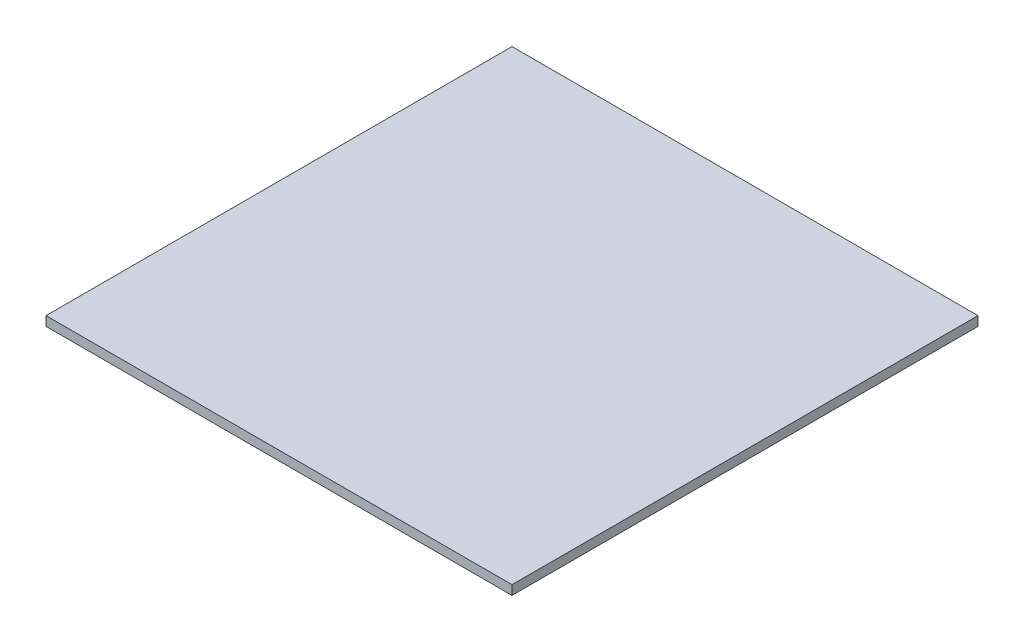
ISO-10303-21;
HEADER;
FILE_DESCRIPTION(('STEP AP214'),'2;1');
FILE_NAME('part.step','',(''),(''),'','','');
FILE_SCHEMA(('AUTOMOTIVE_DESIGN { 1 0 10303 214 1 1 1 1 }'));
ENDSEC;
DATA;
#1=APPLICATION_CONTEXT('core data for automotive mechanical design processes');
#2=APPLICATION_PROTOCOL_DEFINITION('international standard','automotive_design',2000,#1);
#3=PRODUCT_CONTEXT('',#1,'mechanical');
#4=PRODUCT('Part','Part','',(#3));
#5=PRODUCT_RELATED_PRODUCT_CATEGORY('part','',(#4));
#6=PRODUCT_DEFINITION_FORMATION('','',#4);
#7=PRODUCT_DEFINITION_CONTEXT('part definition',#1,'design');
#8=PRODUCT_DEFINITION('design','',#6,#7);
#9=PRODUCT_DEFINITION_SHAPE('','',#8);
#10=(LENGTH_UNIT() NAMED_UNIT(*) SI_UNIT(.MILLI.,.METRE.));
#11=(NAMED_UNIT(*) PLANE_ANGLE_UNIT() SI_UNIT($,.RADIAN.));
#12=(NAMED_UNIT(*) SI_UNIT($,.STERADIAN.) SOLID_ANGLE_UNIT());
#13=UNCERTAINTY_MEASURE_WITH_UNIT(LENGTH_MEASURE(1.E-05),#10,'distance_accuracy_value','');
#14=(GEOMETRIC_REPRESENTATION_CONTEXT(3) GLOBAL_UNCERTAINTY_ASSIGNED_CONTEXT((#13)) GLOBAL_UNIT_ASSIGNED_CONTEXT((#10,
#11,#12)) REPRESENTATION_CONTEXT('',''));
#15=CARTESIAN_POINT('',(0.,0.,0.));
#16=DIRECTION('',(0.,0.,1.));
#17=DIRECTION('',(1.,0.,0.));
#18=AXIS2_PLACEMENT_3D('',#15,#16,#17);
#19=CARTESIAN_POINT('',(0.,10.,0.));
#20=DIRECTION('',(1.,0.,0.));
#21=DIRECTION('',(0.,0.,-1.));
#22=AXIS2_PLACEMENT_3D('',#19,#20,#21);
#23=PLANE('',#22);
#24=DIRECTION('',(0.,0.,1.));
#25=VECTOR('',#24,1.);
#26=CARTESIAN_POINT('',(0.,0.,0.));
#27=LINE('',#26,#25);
#28=CARTESIAN_POINT('',(0.,0.,-500.));
#29=VERTEX_POINT('',#28);
#30=CARTESIAN_POINT('',(0.,0.,0.));
#31=VERTEX_POINT('',#30);
#32=EDGE_CURVE('E107',#29,#31,#27,.T.);
#33=ORIENTED_EDGE('',*,*,#32,.T.);
#34=DIRECTION('',(0.,-1.,0.));
#35=VECTOR('',#34,1.);
#36=CARTESIAN_POINT('',(0.,10.,0.));
#37=LINE('',#36,#35);
#38=CARTESIAN_POINT('',(0.,10.,0.));
#39=VERTEX_POINT('',#38);
#40=EDGE_CURVE('E11',#39,#31,#37,.T.);
#41=ORIENTED_EDGE('',*,*,#40,.F.);
#42=DIRECTION('',(0.,0.,1.));
#43=VECTOR('',#42,1.);
#44=CARTESIAN_POINT('',(0.,10.,0.));
#45=LINE('',#44,#43);
#46=CARTESIAN_POINT('',(0.,10.,-500.));
#47=VERTEX_POINT('',#46);
#48=EDGE_CURVE('E91',#47,#39,#45,.T.);
#49=ORIENTED_EDGE('',*,*,#48,.F.);
#50=DIRECTION('',(0.,-1.,0.));
#51=VECTOR('',#50,1.);
#52=CARTESIAN_POINT('',(0.,10.,-500.));
#53=LINE('',#52,#51);
#54=EDGE_CURVE('E103',#47,#29,#53,.T.);
#55=ORIENTED_EDGE('',*,*,#54,.T.);
#56=EDGE_LOOP('',(#33,#41,#49,#55));
#57=FACE_BOUND('',#56,.T.);
#58=ADVANCED_FACE('F39',(#57),#23,.F.);
#59=CARTESIAN_POINT('',(0.,10.,0.));
#60=DIRECTION('',(0.,0.,-1.));
#61=DIRECTION('',(-1.,0.,0.));
#62=AXIS2_PLACEMENT_3D('',#59,#60,#61);
#63=PLANE('',#62);
#64=DIRECTION('',(1.,0.,0.));
#65=VECTOR('',#64,1.);
#66=CARTESIAN_POINT('',(0.,0.,0.));
#67=LINE('',#66,#65);
#68=CARTESIAN_POINT('',(500.,0.,0.));
#69=VERTEX_POINT('',#68);
#70=EDGE_CURVE('E96',#31,#69,#67,.T.);
#71=ORIENTED_EDGE('',*,*,#70,.T.);
#72=DIRECTION('',(0.,-1.,0.));
#73=VECTOR('',#72,1.);
#74=CARTESIAN_POINT('',(500.,10.,0.));
#75=LINE('',#74,#73);
#76=CARTESIAN_POINT('',(500.,10.,0.));
#77=VERTEX_POINT('',#76);
#78=EDGE_CURVE('E48',#77,#69,#75,.T.);
#79=ORIENTED_EDGE('',*,*,#78,.F.);
#80=DIRECTION('',(1.,0.,0.));
#81=VECTOR('',#80,1.);
#82=CARTESIAN_POINT('',(0.,10.,0.));
#83=LINE('',#82,#81);
#84=EDGE_CURVE('E86',#39,#77,#83,.T.);
#85=ORIENTED_EDGE('',*,*,#84,.F.);
#86=ORIENTED_EDGE('',*,*,#40,.T.);
#87=EDGE_LOOP('',(#71,#79,#85,#86));
#88=FACE_BOUND('',#87,.T.);
#89=ADVANCED_FACE('F95',(#88),#63,.F.);
#90=CARTESIAN_POINT('',(500.,10.,0.));
#91=DIRECTION('',(-1.,0.,0.));
#92=DIRECTION('',(0.,0.,1.));
#93=AXIS2_PLACEMENT_3D('',#90,#91,#92);
#94=PLANE('',#93);
#95=DIRECTION('',(0.,0.,-1.));
#96=VECTOR('',#95,1.);
#97=CARTESIAN_POINT('',(500.,0.,0.));
#98=LINE('',#97,#96);
#99=CARTESIAN_POINT('',(500.,0.,-500.));
#100=VERTEX_POINT('',#99);
#101=EDGE_CURVE('E73',#69,#100,#98,.T.);
#102=ORIENTED_EDGE('',*,*,#101,.T.);
#103=DIRECTION('',(0.,-1.,0.));
#104=VECTOR('',#103,1.);
#105=CARTESIAN_POINT('',(500.,10.,-500.));
#106=LINE('',#105,#104);
#107=CARTESIAN_POINT('',(500.,10.,-500.));
#108=VERTEX_POINT('',#107);
#109=EDGE_CURVE('E98',#108,#100,#106,.T.);
#110=ORIENTED_EDGE('',*,*,#109,.F.);
#111=DIRECTION('',(0.,0.,-1.));
#112=VECTOR('',#111,1.);
#113=CARTESIAN_POINT('',(500.,10.,0.));
#114=LINE('',#113,#112);
#115=EDGE_CURVE('E89',#77,#108,#114,.T.);
#116=ORIENTED_EDGE('',*,*,#115,.F.);
#117=ORIENTED_EDGE('',*,*,#78,.T.);
#118=EDGE_LOOP('',(#102,#110,#116,#117));
#119=FACE_BOUND('',#118,.T.);
#120=ADVANCED_FACE('F99',(#119),#94,.F.);
#121=CARTESIAN_POINT('',(0.,10.,-500.));
#122=DIRECTION('',(0.,0.,1.));
#123=DIRECTION('',(1.,0.,0.));
#124=AXIS2_PLACEMENT_3D('',#121,#122,#123);
#125=PLANE('',#124);
#126=DIRECTION('',(-1.,0.,0.));
#127=VECTOR('',#126,1.);
#128=CARTESIAN_POINT('',(0.,0.,-500.));
#129=LINE('',#128,#127);
#130=EDGE_CURVE('E79',#100,#29,#129,.T.);
#131=ORIENTED_EDGE('',*,*,#130,.T.);
#132=ORIENTED_EDGE('',*,*,#54,.F.);
#133=DIRECTION('',(-1.,0.,0.));
#134=VECTOR('',#133,1.);
#135=CARTESIAN_POINT('',(0.,10.,-500.));
#136=LINE('',#135,#134);
#137=EDGE_CURVE('E56',#108,#47,#136,.T.);
#138=ORIENTED_EDGE('',*,*,#137,.F.);
#139=ORIENTED_EDGE('',*,*,#109,.T.);
#140=EDGE_LOOP('',(#131,#132,#138,#139));
#141=FACE_BOUND('',#140,.T.);
#142=ADVANCED_FACE('F120',(#141),#125,.F.);
#143=CARTESIAN_POINT('',(0.,10.,0.));
#144=DIRECTION('',(0.,-1.,0.));
#145=DIRECTION('',(0.,0.,-1.));
#146=AXIS2_PLACEMENT_3D('',#143,#144,#145);
#147=PLANE('',#146);
#148=ORIENTED_EDGE('',*,*,#48,.T.);
#149=ORIENTED_EDGE('',*,*,#84,.T.);
#150=ORIENTED_EDGE('',*,*,#115,.T.);
#151=ORIENTED_EDGE('',*,*,#137,.T.);
#152=EDGE_LOOP('',(#148,#149,#150,#151));
#153=FACE_BOUND('',#152,.T.);
#154=ADVANCED_FACE('F87',(#153),#147,.F.);
#155=CARTESIAN_POINT('',(0.,0.,0.));
#156=DIRECTION('',(0.,-1.,0.));
#157=DIRECTION('',(0.,0.,-1.));
#158=AXIS2_PLACEMENT_3D('',#155,#156,#157);
#159=PLANE('',#158);
#160=ORIENTED_EDGE('',*,*,#32,.F.);
#161=ORIENTED_EDGE('',*,*,#130,.F.);
#162=ORIENTED_EDGE('',*,*,#101,.F.);
#163=ORIENTED_EDGE('',*,*,#70,.F.);
#164=EDGE_LOOP('',(#160,#161,#162,#163));
#165=FACE_BOUND('',#164,.T.);
#166=ADVANCED_FACE('F123',(#165),#159,.T.);
#167=CLOSED_SHELL('',(#58,#89,#120,#142,#154,#166));
#168=MANIFOLD_SOLID_BREP('B2',#167);
#169=ADVANCED_BREP_SHAPE_REPRESENTATION('',(#18,#168),#14);
#170=SHAPE_DEFINITION_REPRESENTATION(#9,#169);
ENDSEC;
END-ISO-10303-21;
